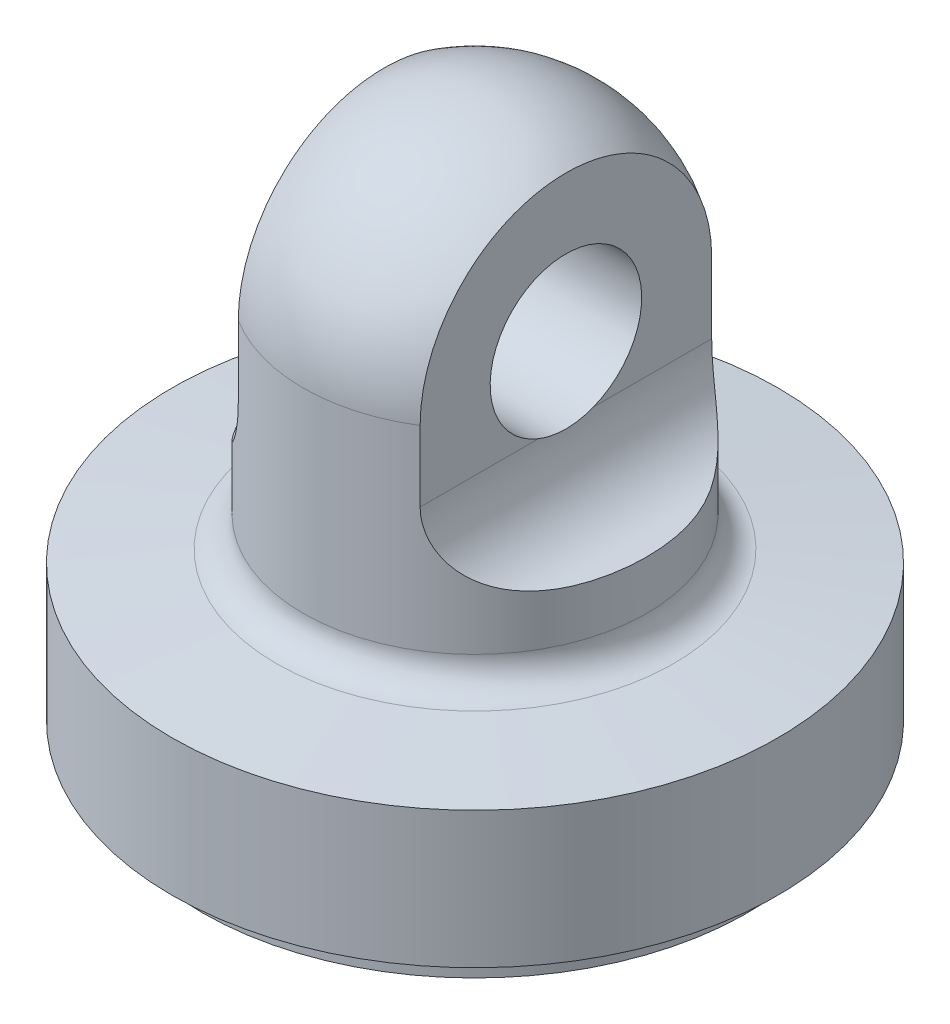
ISO-10303-21;
HEADER;
FILE_DESCRIPTION(('STEP AP214'),'2;1');
FILE_NAME('part.step','',(''),(''),'','','');
FILE_SCHEMA(('AUTOMOTIVE_DESIGN { 1 0 10303 214 1 1 1 1 }'));
ENDSEC;
DATA;
#1=APPLICATION_CONTEXT('core data for automotive mechanical design processes');
#2=APPLICATION_PROTOCOL_DEFINITION('international standard','automotive_design',2000,#1);
#3=PRODUCT_CONTEXT('',#1,'mechanical');
#4=PRODUCT('Part','Part','',(#3));
#5=PRODUCT_RELATED_PRODUCT_CATEGORY('part','',(#4));
#6=PRODUCT_DEFINITION_FORMATION('','',#4);
#7=PRODUCT_DEFINITION_CONTEXT('part definition',#1,'design');
#8=PRODUCT_DEFINITION('design','',#6,#7);
#9=PRODUCT_DEFINITION_SHAPE('','',#8);
#10=(LENGTH_UNIT() NAMED_UNIT(*) SI_UNIT(.MILLI.,.METRE.));
#11=(NAMED_UNIT(*) PLANE_ANGLE_UNIT() SI_UNIT($,.RADIAN.));
#12=(NAMED_UNIT(*) SI_UNIT($,.STERADIAN.) SOLID_ANGLE_UNIT());
#13=UNCERTAINTY_MEASURE_WITH_UNIT(LENGTH_MEASURE(1.E-05),#10,'distance_accuracy_value','');
#14=(GEOMETRIC_REPRESENTATION_CONTEXT(3) GLOBAL_UNCERTAINTY_ASSIGNED_CONTEXT((#13)) GLOBAL_UNIT_ASSIGNED_CONTEXT((#10,
#11,#12)) REPRESENTATION_CONTEXT('',''));
#15=CARTESIAN_POINT('',(0.,0.,0.));
#16=DIRECTION('',(0.,0.,1.));
#17=DIRECTION('',(1.,0.,0.));
#18=AXIS2_PLACEMENT_3D('',#15,#16,#17);
#19=CARTESIAN_POINT('',(0.,6.35,0.));
#20=DIRECTION('',(0.,1.,0.));
#21=DIRECTION('',(0.,0.,1.));
#22=AXIS2_PLACEMENT_3D('',#19,#20,#21);
#23=CYLINDRICAL_SURFACE('',#22,7.2009);
#24=DIRECTION('',(0.,1.,0.));
#25=VECTOR('',#24,1.);
#26=CARTESIAN_POINT('',(3.81,6.35,6.11038957923306));
#27=LINE('',#26,#25);
#28=CARTESIAN_POINT('',(3.81,15.6591,6.11038957923306));
#29=VERTEX_POINT('',#28);
#30=CARTESIAN_POINT('',(3.81,12.7,6.11038957923306));
#31=VERTEX_POINT('',#30);
#32=EDGE_CURVE('E118',#29,#31,#27,.F.);
#33=ORIENTED_EDGE('',*,*,#32,.F.);
#34=CARTESIAN_POINT('',(0.,15.6591,0.));
#35=DIRECTION('',(0.,1.,0.));
#36=DIRECTION('',(0.,0.,1.));
#37=AXIS2_PLACEMENT_3D('',#34,#35,#36);
#38=CIRCLE('',#37,7.2009);
#39=CARTESIAN_POINT('',(-3.81,15.6591,6.11038957923306));
#40=VERTEX_POINT('',#39);
#41=EDGE_CURVE('E120',#40,#29,#38,.T.);
#42=ORIENTED_EDGE('',*,*,#41,.F.);
#43=DIRECTION('',(0.,1.,0.));
#44=VECTOR('',#43,1.);
#45=CARTESIAN_POINT('',(-3.81,6.35,6.11038957923306));
#46=LINE('',#45,#44);
#47=CARTESIAN_POINT('',(-3.81,12.7,6.11038957923306));
#48=VERTEX_POINT('',#47);
#49=EDGE_CURVE('E105',#40,#48,#46,.F.);
#50=ORIENTED_EDGE('',*,*,#49,.T.);
#51=CARTESIAN_POINT('',(-3.81,12.7,6.11038957923306));
#52=CARTESIAN_POINT('',(-3.80998733358801,12.6231014532753,6.11038635616931));
#53=CARTESIAN_POINT('',(-3.81279349091128,12.5462070693066,6.10864746791412));
#54=CARTESIAN_POINT('',(-3.82394828994141,12.3929889222162,6.10167677945823));
#55=CARTESIAN_POINT('',(-3.83229632195482,12.316665097258,6.0964453634902));
#56=CARTESIAN_POINT('',(-3.85441689591902,12.1652895713145,6.0824824704275));
#57=CARTESIAN_POINT('',(-3.86817820699379,12.0902355699656,6.07375823918027));
#58=CARTESIAN_POINT('',(-3.90092084468937,11.9417997268901,6.05278055671562));
#59=CARTESIAN_POINT('',(-3.91990214251921,11.8684178759432,6.04052712496357));
#60=CARTESIAN_POINT('',(-3.98433550874055,11.6515195382029,5.99839168622441));
#61=CARTESIAN_POINT('',(-4.03729100701177,11.5111571195608,5.96312618319958));
#62=CARTESIAN_POINT('',(-4.16019062583858,11.2429910909109,5.87803668739616));
#63=CARTESIAN_POINT('',(-4.23013307938339,11.1151862502957,5.82821412307394));
#64=CARTESIAN_POINT('',(-4.38423949926996,10.8731046561016,5.71320820042626));
#65=CARTESIAN_POINT('',(-4.46859574191052,10.7590520196778,5.64781170713921));
#66=CARTESIAN_POINT('',(-4.64617052489352,10.5483686689604,5.50265371498206));
#67=CARTESIAN_POINT('',(-4.73939233147083,10.4517444138713,5.42288691207385));
#68=CARTESIAN_POINT('',(-4.93827246293446,10.2686739405031,5.24270095614019));
#69=CARTESIAN_POINT('',(-5.04431075178691,10.1838184712385,5.14109544815751));
#70=CARTESIAN_POINT('',(-5.25623482313289,10.033749254721,4.92422144314117));
#71=CARTESIAN_POINT('',(-5.36212051309106,9.96854455625662,4.80894668563177));
#72=CARTESIAN_POINT('',(-5.54709204545837,9.86775710215691,4.59329238505389));
#73=CARTESIAN_POINT('',(-5.62699314709021,9.82881586405256,4.49513485986877));
#74=CARTESIAN_POINT('',(-5.78292896143135,9.7601170052114,4.29267036741411));
#75=CARTESIAN_POINT('',(-5.85896188378571,9.73036360526523,4.18836060000114));
#76=CARTESIAN_POINT('',(-6.00626490029367,9.67860728816008,3.9742515266402));
#77=CARTESIAN_POINT('',(-6.07752366080192,9.65662231890872,3.86444016916531));
#78=CARTESIAN_POINT('',(-6.21439030598146,9.61912039823451,3.6402713030149));
#79=CARTESIAN_POINT('',(-6.27999651827241,9.60360535584605,3.52591246343391));
#80=CARTESIAN_POINT('',(-6.43051455061035,9.57249928552491,3.24591382668313));
#81=CARTESIAN_POINT('',(-6.51240458871308,9.55945163791039,3.07836028575431));
#82=CARTESIAN_POINT('',(-6.66306030764518,9.54045201566858,2.73704752743541));
#83=CARTESIAN_POINT('',(-6.7318207506157,9.5345028679364,2.56328586608596));
#84=CARTESIAN_POINT('',(-6.85566325153392,9.52702874357367,2.21082365670566));
#85=CARTESIAN_POINT('',(-6.91074169388705,9.52550493524484,2.03212181702222));
#86=CARTESIAN_POINT('',(-7.00682699844442,9.52471152842489,1.67100185543952));
#87=CARTESIAN_POINT('',(-7.04783548185924,9.52544167012544,1.48858416426687));
#88=CARTESIAN_POINT('',(-7.11629878695636,9.5275265352169,1.11701766687077));
#89=CARTESIAN_POINT('',(-7.14343113207907,9.52889481740594,0.927809456391798));
#90=CARTESIAN_POINT('',(-7.1825710149099,9.53109236924875,0.547827939624263));
#91=CARTESIAN_POINT('',(-7.19457819928696,9.53192162631041,0.357054596878234));
#92=CARTESIAN_POINT('',(-7.20339064331454,9.53251662510466,-0.0248852898666734));
#93=CARTESIAN_POINT('',(-7.20019276933215,9.53228214761108,-0.216051906800938));
#94=CARTESIAN_POINT('',(-7.17860912928656,9.53089049089978,-0.597519970973486));
#95=CARTESIAN_POINT('',(-7.16022327691978,9.5297333064389,-0.787821413289357));
#96=CARTESIAN_POINT('',(-7.1068252210731,9.52721812605474,-1.17770677055332));
#97=CARTESIAN_POINT('',(-7.07088302414944,9.52585225332619,-1.37716386124502));
#98=CARTESIAN_POINT('',(-6.9823069610051,9.524692697216,-1.77239078694926));
#99=CARTESIAN_POINT('',(-6.92966952679212,9.52489935012107,-1.96815982429291));
#100=CARTESIAN_POINT('',(-6.80813332907772,9.52934738581037,-2.354410700806));
#101=CARTESIAN_POINT('',(-6.7392449144971,9.53358620602486,-2.54489581894793));
#102=CARTESIAN_POINT('',(-6.58579115995243,9.54925291731517,-2.91910060382037));
#103=CARTESIAN_POINT('',(-6.50123405302712,9.56067704042131,-3.10282376310078));
#104=CARTESIAN_POINT('',(-6.35008509045248,9.58854941397494,-3.39798642622453));
#105=CARTESIAN_POINT('',(-6.28776917791238,9.60177521781386,-3.5119366518069));
#106=CARTESIAN_POINT('',(-6.15746128725953,9.63400724337432,-3.7356892986274));
#107=CARTESIAN_POINT('',(-6.0894708600034,9.65301188945527,-3.84549284132392));
#108=CARTESIAN_POINT('',(-5.94851003766728,9.69803760610971,-4.06012915731318));
#109=CARTESIAN_POINT('',(-5.8755476603564,9.72404757095896,-4.1649694922267));
#110=CARTESIAN_POINT('',(-5.72539617515466,9.78442691390213,-4.36907675644182));
#111=CARTESIAN_POINT('',(-5.64820820925843,9.81879404197259,-4.46834517704685));
#112=CARTESIAN_POINT('',(-5.50938937453864,9.88793573235742,-4.63773592511761));
#113=CARTESIAN_POINT('',(-5.44839237550929,9.92069502567928,-4.70920254310317));
#114=CARTESIAN_POINT('',(-5.32530426157729,9.99239830352572,-4.84795728682532));
#115=CARTESIAN_POINT('',(-5.26321342621698,10.0313407276948,-4.91524646082517));
#116=CARTESIAN_POINT('',(-5.13877989523449,10.1158668385997,-5.04519420162521));
#117=CARTESIAN_POINT('',(-5.0764373943672,10.1614460954836,-5.10785581543792));
#118=CARTESIAN_POINT('',(-4.9524501657472,10.2595848611706,-5.22816167402015));
#119=CARTESIAN_POINT('',(-4.89080533195859,10.3121432933429,-5.28580669040075));
#120=CARTESIAN_POINT('',(-4.7275823692143,10.4630171620506,-5.43340706528982));
#121=CARTESIAN_POINT('',(-4.62756950433674,10.5680177918102,-5.51845252697064));
#122=CARTESIAN_POINT('',(-4.43834189155268,10.7980740569018,-5.67177060536483));
#123=CARTESIAN_POINT('',(-4.34912347170927,10.923122838625,-5.74004893392349));
#124=CARTESIAN_POINT('',(-4.18680926440662,11.1915441087122,-5.85950692123186));
#125=CARTESIAN_POINT('',(-4.11378160364622,11.3349901599489,-5.91061477854303));
#126=CARTESIAN_POINT('',(-3.98925936427997,11.6357523958736,-5.99537406226361));
#127=CARTESIAN_POINT('',(-3.93775928648484,11.7930650259162,-6.02902994728255));
#128=CARTESIAN_POINT('',(-3.86949144410716,12.0756818023015,-6.07298774635886));
#129=CARTESIAN_POINT('',(-3.8472508943892,12.1991117048108,-6.08703081152104));
#130=CARTESIAN_POINT('',(-3.82493944522159,12.3860161188107,-6.1010547590217));
#131=CARTESIAN_POINT('',(-3.81934385297369,12.4486155173614,-6.10455596499964));
#132=CARTESIAN_POINT('',(-3.81187196473202,12.5741377564182,-6.10922266327482));
#133=CARTESIAN_POINT('',(-3.80999656902357,12.6370606715224,-6.11038759019468));
#134=CARTESIAN_POINT('',(-3.81,12.7,-6.11038957923306));
#135=B_SPLINE_CURVE_WITH_KNOTS('',3,(#51,#52,#53,#54,#55,#56,#57,#58,#59,#60,#61,#62,#63,#64,
#65,#66,#67,#68,#69,#70,#71,#72,#73,#74,#75,#76,#77,#78,#79,#80,#81,#82,#83,#84,#85,#86,#87,#88,
#89,#90,#91,#92,#93,#94,#95,#96,#97,#98,#99,#100,#101,#102,#103,#104,#105,#106,#107,#108,#109,
#110,#111,#112,#113,#114,#115,#116,#117,#118,#119,#120,#121,#122,#123,#124,#125,#126,#127,#128,
#129,#130,#131,#132,#133,#134),.UNSPECIFIED.,.F.,.F.,(4,2,2,2,2,2,2,2,2,2,2,2,2,2,2,2,2,2,2,2,2,
2,2,2,2,2,2,2,2,2,2,2,2,2,2,2,2,2,2,2,2,4),(0.,0.230617498194052,0.461209629036425,
0.691325854720207,0.921440811217572,1.38139068014647,1.8412954302308,2.3078978438225,
2.77467283313036,3.28160448955474,3.78876922248567,4.18550327362115,4.5824193097593,
4.98024646133317,5.37819091396325,5.93823359357548,6.49849922931978,7.05891276328739,
7.61926170191953,8.19210047656011,8.76495263274242,9.33792285398703,9.91089633107794,
10.5181926527958,11.1256188492937,11.7326592649817,12.3393816140509,12.7307565027546,
13.1220247759765,13.5126763752364,13.9032229144475,14.2014830428485,14.4996680225386,
14.7976548789104,15.0955958201265,15.5975879801723,16.09940889499,16.6033028789676,
17.1070680651935,17.4844147947459,17.6731159091838,17.861862683609),.UNSPECIFIED.);
#136=CARTESIAN_POINT('',(-3.81,12.7,-6.11038957923306));
#137=VERTEX_POINT('',#136);
#138=EDGE_CURVE('E147',#48,#137,#135,.T.);
#139=ORIENTED_EDGE('',*,*,#138,.T.);
#140=DIRECTION('',(0.,1.,0.));
#141=VECTOR('',#140,1.);
#142=CARTESIAN_POINT('',(-3.81,6.35,-6.11038957923306));
#143=LINE('',#142,#141);
#144=CARTESIAN_POINT('',(-3.81,15.6591,-6.11038957923306));
#145=VERTEX_POINT('',#144);
#146=EDGE_CURVE('E102',#137,#145,#143,.T.);
#147=ORIENTED_EDGE('',*,*,#146,.T.);
#148=CARTESIAN_POINT('',(3.81,15.6591,-6.11038957923306));
#149=VERTEX_POINT('',#148);
#150=EDGE_CURVE('E123',#149,#145,#38,.T.);
#151=ORIENTED_EDGE('',*,*,#150,.F.);
#152=DIRECTION('',(0.,1.,0.));
#153=VECTOR('',#152,1.);
#154=CARTESIAN_POINT('',(3.81,6.35,-6.11038957923306));
#155=LINE('',#154,#153);
#156=CARTESIAN_POINT('',(3.81,12.7,-6.11038957923306));
#157=VERTEX_POINT('',#156);
#158=EDGE_CURVE('E116',#157,#149,#155,.T.);
#159=ORIENTED_EDGE('',*,*,#158,.F.);
#160=CARTESIAN_POINT('',(3.81,12.7,6.11038957923306));
#161=CARTESIAN_POINT('',(3.80998733358801,12.6231014532753,6.11038635616931));
#162=CARTESIAN_POINT('',(3.81279349091128,12.5462070693066,6.10864746791412));
#163=CARTESIAN_POINT('',(3.82394828994141,12.3929889222162,6.10167677945823));
#164=CARTESIAN_POINT('',(3.83229632195482,12.316665097258,6.0964453634902));
#165=CARTESIAN_POINT('',(3.85441689591902,12.1652895713145,6.0824824704275));
#166=CARTESIAN_POINT('',(3.86817820699379,12.0902355699656,6.07375823918027));
#167=CARTESIAN_POINT('',(3.90092084468937,11.9417997268901,6.05278055671562));
#168=CARTESIAN_POINT('',(3.91990214251921,11.8684178759432,6.04052712496357));
#169=CARTESIAN_POINT('',(3.98433550874055,11.6515195382029,5.99839168622441));
#170=CARTESIAN_POINT('',(4.03729100701177,11.5111571195608,5.96312618319958));
#171=CARTESIAN_POINT('',(4.16019062583858,11.2429910909109,5.87803668739616));
#172=CARTESIAN_POINT('',(4.23013307938339,11.1151862502957,5.82821412307394));
#173=CARTESIAN_POINT('',(4.38423949926996,10.8731046561016,5.71320820042626));
#174=CARTESIAN_POINT('',(4.46859574191052,10.7590520196778,5.64781170713921));
#175=CARTESIAN_POINT('',(4.64617052489352,10.5483686689604,5.50265371498206));
#176=CARTESIAN_POINT('',(4.73939233147083,10.4517444138713,5.42288691207385));
#177=CARTESIAN_POINT('',(4.93827246293446,10.2686739405031,5.24270095614019));
#178=CARTESIAN_POINT('',(5.04431075178691,10.1838184712385,5.14109544815751));
#179=CARTESIAN_POINT('',(5.25623482313289,10.033749254721,4.92422144314117));
#180=CARTESIAN_POINT('',(5.36212051309106,9.96854455625662,4.80894668563177));
#181=CARTESIAN_POINT('',(5.54709204545837,9.86775710215691,4.59329238505389));
#182=CARTESIAN_POINT('',(5.62699314709021,9.82881586405256,4.49513485986877));
#183=CARTESIAN_POINT('',(5.78292896143135,9.7601170052114,4.29267036741411));
#184=CARTESIAN_POINT('',(5.85896188378571,9.73036360526523,4.18836060000114));
#185=CARTESIAN_POINT('',(6.00626490029367,9.67860728816008,3.9742515266402));
#186=CARTESIAN_POINT('',(6.07752366080192,9.65662231890872,3.86444016916531));
#187=CARTESIAN_POINT('',(6.21439030598146,9.61912039823451,3.6402713030149));
#188=CARTESIAN_POINT('',(6.27999651827241,9.60360535584605,3.52591246343391));
#189=CARTESIAN_POINT('',(6.43051455061035,9.57249928552491,3.24591382668313));
#190=CARTESIAN_POINT('',(6.51240458871308,9.55945163791039,3.07836028575431));
#191=CARTESIAN_POINT('',(6.66306030764518,9.54045201566858,2.73704752743541));
#192=CARTESIAN_POINT('',(6.7318207506157,9.5345028679364,2.56328586608596));
#193=CARTESIAN_POINT('',(6.85566325153392,9.52702874357367,2.21082365670566));
#194=CARTESIAN_POINT('',(6.91074169388705,9.52550493524484,2.03212181702222));
#195=CARTESIAN_POINT('',(7.00682699844442,9.52471152842489,1.67100185543952));
#196=CARTESIAN_POINT('',(7.04783548185924,9.52544167012544,1.48858416426687));
#197=CARTESIAN_POINT('',(7.11629878695636,9.5275265352169,1.11701766687077));
#198=CARTESIAN_POINT('',(7.14343113207907,9.52889481740594,0.927809456391798));
#199=CARTESIAN_POINT('',(7.1825710149099,9.53109236924875,0.547827939624263));
#200=CARTESIAN_POINT('',(7.19457819928696,9.53192162631041,0.357054596878234));
#201=CARTESIAN_POINT('',(7.20339064331454,9.53251662510466,-0.0248852898666734));
#202=CARTESIAN_POINT('',(7.20019276933215,9.53228214761108,-0.216051906800938));
#203=CARTESIAN_POINT('',(7.17860912928656,9.53089049089978,-0.597519970973486));
#204=CARTESIAN_POINT('',(7.16022327691978,9.5297333064389,-0.787821413289357));
#205=CARTESIAN_POINT('',(7.1068252210731,9.52721812605474,-1.17770677055332));
#206=CARTESIAN_POINT('',(7.07088302414944,9.52585225332619,-1.37716386124502));
#207=CARTESIAN_POINT('',(6.9823069610051,9.524692697216,-1.77239078694926));
#208=CARTESIAN_POINT('',(6.92966952679212,9.52489935012107,-1.96815982429291));
#209=CARTESIAN_POINT('',(6.80813332907772,9.52934738581037,-2.354410700806));
#210=CARTESIAN_POINT('',(6.7392449144971,9.53358620602486,-2.54489581894793));
#211=CARTESIAN_POINT('',(6.58579115995243,9.54925291731517,-2.91910060382037));
#212=CARTESIAN_POINT('',(6.50123405302712,9.56067704042131,-3.10282376310078));
#213=CARTESIAN_POINT('',(6.35008509045248,9.58854941397494,-3.39798642622453));
#214=CARTESIAN_POINT('',(6.28776917791238,9.60177521781386,-3.5119366518069));
#215=CARTESIAN_POINT('',(6.15746128725953,9.63400724337432,-3.7356892986274));
#216=CARTESIAN_POINT('',(6.0894708600034,9.65301188945527,-3.84549284132392));
#217=CARTESIAN_POINT('',(5.94851003766728,9.69803760610971,-4.06012915731318));
#218=CARTESIAN_POINT('',(5.8755476603564,9.72404757095896,-4.1649694922267));
#219=CARTESIAN_POINT('',(5.72539617515466,9.78442691390213,-4.36907675644182));
#220=CARTESIAN_POINT('',(5.64820820925843,9.81879404197259,-4.46834517704685));
#221=CARTESIAN_POINT('',(5.50938937453864,9.88793573235742,-4.63773592511761));
#222=CARTESIAN_POINT('',(5.44839237550929,9.92069502567928,-4.70920254310317));
#223=CARTESIAN_POINT('',(5.32530426157729,9.99239830352572,-4.84795728682532));
#224=CARTESIAN_POINT('',(5.26321342621698,10.0313407276948,-4.91524646082517));
#225=CARTESIAN_POINT('',(5.13877989523449,10.1158668385997,-5.04519420162521));
#226=CARTESIAN_POINT('',(5.0764373943672,10.1614460954836,-5.10785581543792));
#227=CARTESIAN_POINT('',(4.9524501657472,10.2595848611706,-5.22816167402015));
#228=CARTESIAN_POINT('',(4.89080533195859,10.3121432933429,-5.28580669040075));
#229=CARTESIAN_POINT('',(4.7275823692143,10.4630171620506,-5.43340706528982));
#230=CARTESIAN_POINT('',(4.62756950433674,10.5680177918102,-5.51845252697064));
#231=CARTESIAN_POINT('',(4.43834189155268,10.7980740569018,-5.67177060536483));
#232=CARTESIAN_POINT('',(4.34912347170927,10.923122838625,-5.74004893392349));
#233=CARTESIAN_POINT('',(4.18680926440662,11.1915441087122,-5.85950692123186));
#234=CARTESIAN_POINT('',(4.11378160364622,11.3349901599489,-5.91061477854303));
#235=CARTESIAN_POINT('',(3.98925936427997,11.6357523958736,-5.99537406226361));
#236=CARTESIAN_POINT('',(3.93775928648484,11.7930650259162,-6.02902994728255));
#237=CARTESIAN_POINT('',(3.86949144410716,12.0756818023015,-6.07298774635886));
#238=CARTESIAN_POINT('',(3.8472508943892,12.1991117048108,-6.08703081152104));
#239=CARTESIAN_POINT('',(3.82493944522159,12.3860161188107,-6.1010547590217));
#240=CARTESIAN_POINT('',(3.81934385297369,12.4486155173614,-6.10455596499964));
#241=CARTESIAN_POINT('',(3.81187196473202,12.5741377564182,-6.10922266327482));
#242=CARTESIAN_POINT('',(3.80999656902357,12.6370606715224,-6.11038759019468));
#243=CARTESIAN_POINT('',(3.81,12.7,-6.11038957923306));
#244=B_SPLINE_CURVE_WITH_KNOTS('',3,(#160,#161,#162,#163,#164,#165,#166,#167,#168,#169,#170,
#171,#172,#173,#174,#175,#176,#177,#178,#179,#180,#181,#182,#183,#184,#185,#186,#187,#188,#189,
#190,#191,#192,#193,#194,#195,#196,#197,#198,#199,#200,#201,#202,#203,#204,#205,#206,#207,#208,
#209,#210,#211,#212,#213,#214,#215,#216,#217,#218,#219,#220,#221,#222,#223,#224,#225,#226,#227,
#228,#229,#230,#231,#232,#233,#234,#235,#236,#237,#238,#239,#240,#241,#242,#243),.UNSPECIFIED.,
.F.,.F.,(4,2,2,2,2,2,2,2,2,2,2,2,2,2,2,2,2,2,2,2,2,2,2,2,2,2,2,2,2,2,2,2,2,2,2,2,2,2,2,2,2,4),
(0.,0.230617498194052,0.461209629036425,0.691325854720207,0.921440811217572,1.38139068014647,
1.8412954302308,2.3078978438225,2.77467283313036,3.28160448955474,3.78876922248567,
4.18550327362115,4.5824193097593,4.98024646133317,5.37819091396325,5.93823359357548,
6.49849922931978,7.05891276328739,7.61926170191953,8.19210047656011,8.76495263274242,
9.33792285398703,9.91089633107794,10.5181926527958,11.1256188492937,11.7326592649817,
12.3393816140509,12.7307565027546,13.1220247759765,13.5126763752364,13.9032229144475,
14.2014830428485,14.4996680225386,14.7976548789104,15.0955958201265,15.5975879801723,
16.09940889499,16.6033028789676,17.1070680651935,17.4844147947459,17.6731159091838,
17.861862683609),.UNSPECIFIED.);
#245=EDGE_CURVE('E46',#31,#157,#244,.T.);
#246=ORIENTED_EDGE('',*,*,#245,.F.);
#247=EDGE_LOOP('',(#33,#42,#50,#139,#147,#151,#159,#246));
#248=FACE_BOUND('',#247,.T.);
#249=CARTESIAN_POINT('',(0.,7.48178785429264,0.));
#250=DIRECTION('',(0.,1.,0.));
#251=DIRECTION('',(0.,0.,1.));
#252=AXIS2_PLACEMENT_3D('',#249,#250,#251);
#253=CIRCLE('',#252,7.2009);
#254=CARTESIAN_POINT('',(0.,7.48178785429264,7.2009));
#255=VERTEX_POINT('',#254);
#256=EDGE_CURVE('E124',#255,#255,#253,.T.);
#257=ORIENTED_EDGE('',*,*,#256,.T.);
#258=EDGE_LOOP('',(#257));
#259=FACE_BOUND('',#258,.T.);
#260=ADVANCED_FACE('F33',(#248,#259),#23,.T.);
#261=CARTESIAN_POINT('',(0.,15.6591,0.));
#262=DIRECTION('',(0.,1.,0.));
#263=DIRECTION('',(1.,0.,0.));
#264=AXIS2_PLACEMENT_3D('',#261,#262,#263);
#265=SPHERICAL_SURFACE('',#264,7.2009);
#266=CARTESIAN_POINT('',(3.81,15.6591,0.));
#267=DIRECTION('',(-1.,0.,0.));
#268=DIRECTION('',(0.,-1.,0.));
#269=AXIS2_PLACEMENT_3D('',#266,#267,#268);
#270=CIRCLE('',#269,6.11038957923306);
#271=EDGE_CURVE('E145',#149,#29,#270,.F.);
#272=ORIENTED_EDGE('',*,*,#271,.F.);
#273=ORIENTED_EDGE('',*,*,#150,.T.);
#274=CARTESIAN_POINT('',(-3.81,15.6591,0.));
#275=DIRECTION('',(-1.,0.,0.));
#276=DIRECTION('',(0.,-1.,0.));
#277=AXIS2_PLACEMENT_3D('',#274,#275,#276);
#278=CIRCLE('',#277,6.11038957923306);
#279=EDGE_CURVE('E142',#145,#40,#278,.F.);
#280=ORIENTED_EDGE('',*,*,#279,.T.);
#281=ORIENTED_EDGE('',*,*,#41,.T.);
#282=EDGE_LOOP('',(#272,#273,#280,#281));
#283=FACE_BOUND('',#282,.T.);
#284=ADVANCED_FACE('F181',(#283),#265,.T.);
#285=CARTESIAN_POINT('',(-11.43,-1.27,0.));
#286=DIRECTION('',(0.,-1.,0.));
#287=DIRECTION('',(0.,0.,-1.));
#288=AXIS2_PLACEMENT_3D('',#285,#286,#287);
#289=PLANE('',#288);
#290=CARTESIAN_POINT('',(0.,-1.27,0.));
#291=DIRECTION('',(0.,1.,0.));
#292=DIRECTION('',(0.,0.,1.));
#293=AXIS2_PLACEMENT_3D('',#290,#291,#292);
#294=CIRCLE('',#293,11.43);
#295=CARTESIAN_POINT('',(0.,-1.27,11.43));
#296=VERTEX_POINT('',#295);
#297=EDGE_CURVE('E139',#296,#296,#294,.T.);
#298=ORIENTED_EDGE('',*,*,#297,.F.);
#299=EDGE_LOOP('',(#298));
#300=FACE_BOUND('',#299,.T.);
#301=ADVANCED_FACE('F35',(#300),#289,.T.);
#302=CARTESIAN_POINT('',(0.,6.35,0.));
#303=DIRECTION('',(0.,1.,0.));
#304=DIRECTION('',(0.,0.,1.));
#305=AXIS2_PLACEMENT_3D('',#302,#303,#304);
#306=CYLINDRICAL_SURFACE('',#305,11.43);
#307=ORIENTED_EDGE('',*,*,#297,.T.);
#308=EDGE_LOOP('',(#307));
#309=FACE_BOUND('',#308,.T.);
#310=CARTESIAN_POINT('',(0.,0.,0.));
#311=DIRECTION('',(0.,1.,0.));
#312=DIRECTION('',(0.,0.,1.));
#313=AXIS2_PLACEMENT_3D('',#310,#311,#312);
#314=CIRCLE('',#313,11.43);
#315=CARTESIAN_POINT('',(0.,0.,11.43));
#316=VERTEX_POINT('',#315);
#317=EDGE_CURVE('E136',#316,#316,#314,.T.);
#318=ORIENTED_EDGE('',*,*,#317,.F.);
#319=EDGE_LOOP('',(#318));
#320=FACE_BOUND('',#319,.T.);
#321=ADVANCED_FACE('F210',(#309,#320),#306,.T.);
#322=CARTESIAN_POINT('',(-12.7,0.,0.));
#323=DIRECTION('',(0.,-1.,0.));
#324=DIRECTION('',(0.,0.,-1.));
#325=AXIS2_PLACEMENT_3D('',#322,#323,#324);
#326=PLANE('',#325);
#327=ORIENTED_EDGE('',*,*,#317,.T.);
#328=EDGE_LOOP('',(#327));
#329=FACE_BOUND('',#328,.T.);
#330=CARTESIAN_POINT('',(0.,0.,0.));
#331=DIRECTION('',(0.,1.,0.));
#332=DIRECTION('',(0.,0.,1.));
#333=AXIS2_PLACEMENT_3D('',#330,#331,#332);
#334=CIRCLE('',#333,12.7);
#335=CARTESIAN_POINT('',(0.,0.,12.7));
#336=VERTEX_POINT('',#335);
#337=EDGE_CURVE('E133',#336,#336,#334,.T.);
#338=ORIENTED_EDGE('',*,*,#337,.F.);
#339=EDGE_LOOP('',(#338));
#340=FACE_BOUND('',#339,.T.);
#341=ADVANCED_FACE('F207',(#329,#340),#326,.T.);
#342=CARTESIAN_POINT('',(0.,6.35,0.));
#343=DIRECTION('',(0.,1.,0.));
#344=DIRECTION('',(0.,0.,1.));
#345=AXIS2_PLACEMENT_3D('',#342,#343,#344);
#346=CYLINDRICAL_SURFACE('',#345,12.7);
#347=ORIENTED_EDGE('',*,*,#337,.T.);
#348=EDGE_LOOP('',(#347));
#349=FACE_BOUND('',#348,.T.);
#350=CARTESIAN_POINT('',(0.,5.715,0.));
#351=DIRECTION('',(0.,1.,0.));
#352=DIRECTION('',(0.,0.,1.));
#353=AXIS2_PLACEMENT_3D('',#350,#351,#352);
#354=CIRCLE('',#353,12.7);
#355=CARTESIAN_POINT('',(0.,5.715,12.7));
#356=VERTEX_POINT('',#355);
#357=EDGE_CURVE('E130',#356,#356,#354,.T.);
#358=ORIENTED_EDGE('',*,*,#357,.F.);
#359=EDGE_LOOP('',(#358));
#360=FACE_BOUND('',#359,.T.);
#361=ADVANCED_FACE('F201',(#349,#360),#346,.T.);
#362=CARTESIAN_POINT('',(0.,6.22017127115639,0.));
#363=DIRECTION('',(0.,-1.,0.));
#364=DIRECTION('',(0.,0.,-1.));
#365=AXIS2_PLACEMENT_3D('',#362,#363,#364);
#366=CONICAL_SURFACE('',#365,8.32521679178565,1.45583206359421);
#367=ORIENTED_EDGE('',*,*,#357,.T.);
#368=EDGE_LOOP('',(#367));
#369=FACE_BOUND('',#368,.T.);
#370=CARTESIAN_POINT('',(0.,6.22017127115639,0.));
#371=DIRECTION('',(0.,1.,0.));
#372=DIRECTION('',(0.,0.,1.));
#373=AXIS2_PLACEMENT_3D('',#370,#371,#372);
#374=CIRCLE('',#373,8.32521679178565);
#375=CARTESIAN_POINT('',(0.,6.22017127115639,8.32521679178565));
#376=VERTEX_POINT('',#375);
#377=EDGE_CURVE('E127',#376,#376,#374,.T.);
#378=ORIENTED_EDGE('',*,*,#377,.F.);
#379=EDGE_LOOP('',(#378));
#380=FACE_BOUND('',#379,.T.);
#381=ADVANCED_FACE('F194',(#369,#380),#366,.T.);
#382=CARTESIAN_POINT('',(0.,7.48178785429264,0.));
#383=DIRECTION('',(0.,1.,0.));
#384=DIRECTION('',(0.,0.,1.));
#385=AXIS2_PLACEMENT_3D('',#382,#383,#384);
#386=TOROIDAL_SURFACE('',#385,8.4709,1.27);
#387=ORIENTED_EDGE('',*,*,#377,.T.);
#388=EDGE_LOOP('',(#387));
#389=FACE_BOUND('',#388,.T.);
#390=ORIENTED_EDGE('',*,*,#256,.F.);
#391=EDGE_LOOP('',(#390));
#392=FACE_BOUND('',#391,.T.);
#393=ADVANCED_FACE('F192',(#389,#392),#386,.F.);
#394=CARTESIAN_POINT('',(-3.81,22.86,-12.7));
#395=DIRECTION('',(-1.,0.,0.));
#396=DIRECTION('',(0.,-1.,0.));
#397=AXIS2_PLACEMENT_3D('',#394,#395,#396);
#398=PLANE('',#397);
#399=CARTESIAN_POINT('',(-3.81,15.6591,0.));
#400=DIRECTION('',(-1.,0.,0.));
#401=DIRECTION('',(0.,-1.,0.));
#402=AXIS2_PLACEMENT_3D('',#399,#400,#401);
#403=CIRCLE('',#402,3.175);
#404=CARTESIAN_POINT('',(-3.81,12.7,1.15080501823724));
#405=VERTEX_POINT('',#404);
#406=CARTESIAN_POINT('',(-3.81,12.7,-1.15080501823723));
#407=VERTEX_POINT('',#406);
#408=EDGE_CURVE('E52',#405,#407,#403,.T.);
#409=ORIENTED_EDGE('',*,*,#408,.F.);
#410=DIRECTION('',(0.,0.,1.));
#411=VECTOR('',#410,1.);
#412=CARTESIAN_POINT('',(-3.81,12.7,-12.7));
#413=LINE('',#412,#411);
#414=EDGE_CURVE('E112',#405,#48,#413,.T.);
#415=ORIENTED_EDGE('',*,*,#414,.T.);
#416=ORIENTED_EDGE('',*,*,#49,.F.);
#417=ORIENTED_EDGE('',*,*,#279,.F.);
#418=ORIENTED_EDGE('',*,*,#146,.F.);
#419=EDGE_CURVE('E107',#137,#407,#413,.T.);
#420=ORIENTED_EDGE('',*,*,#419,.T.);
#421=EDGE_LOOP('',(#409,#415,#416,#417,#418,#420));
#422=FACE_BOUND('',#421,.T.);
#423=ADVANCED_FACE('F165',(#422),#398,.T.);
#424=CARTESIAN_POINT('',(-6.985,12.7,-12.7));
#425=DIRECTION('',(0.,0.,1.));
#426=DIRECTION('',(1.,0.,0.));
#427=AXIS2_PLACEMENT_3D('',#424,#425,#426);
#428=CYLINDRICAL_SURFACE('',#427,3.175);
#429=CARTESIAN_POINT('',(-3.81,12.7,-1.15080501823724));
#430=CARTESIAN_POINT('',(-3.81002339611876,12.6676709480418,-1.06770211852475));
#431=CARTESIAN_POINT('',(-3.81049485803839,12.6388616185873,-0.983235170105028));
#432=CARTESIAN_POINT('',(-3.81185384312562,12.5884449847997,-0.812180556369154));
#433=CARTESIAN_POINT('',(-3.81274136933871,12.566837733186,-0.725592875534186));
#434=CARTESIAN_POINT('',(-3.81445343324419,12.5309666282981,-0.550799745218378));
#435=CARTESIAN_POINT('',(-3.8152778934354,12.5167116905417,-0.462592465320763));
#436=CARTESIAN_POINT('',(-3.81656283112022,12.4956841259356,-0.285293621779998));
#437=CARTESIAN_POINT('',(-3.81702333333011,12.4889109909867,-0.196202118600307));
#438=CARTESIAN_POINT('',(-3.81743029549092,12.4828925848461,-0.0176960642956959));
#439=CARTESIAN_POINT('',(-3.8173763632169,12.4836530575882,0.0717186813549191));
#440=CARTESIAN_POINT('',(-3.81677073187476,12.4927103409081,0.250164092086279));
#441=CARTESIAN_POINT('',(-3.81621903658917,12.5010070942174,0.339194760080479));
#442=CARTESIAN_POINT('',(-3.81480115611041,12.5250477141103,0.516029726119425));
#443=CARTESIAN_POINT('',(-3.81393569623573,12.5407744303249,0.603836371454246));
#444=CARTESIAN_POINT('',(-3.8122261535973,12.5795516066959,0.777778026827594));
#445=CARTESIAN_POINT('',(-3.81138205858091,12.6025977615019,0.8639139880515));
#446=CARTESIAN_POINT('',(-3.81055159258283,12.6398799435382,0.982959910560128));
#447=CARTESIAN_POINT('',(-3.81035435778872,12.6511180474531,1.01683007870654));
#448=CARTESIAN_POINT('',(-3.81007875138538,12.6747178806433,1.08413941950069));
#449=CARTESIAN_POINT('',(-3.81000026208465,12.6870784844813,1.11757898628355));
#450=CARTESIAN_POINT('',(-3.81,12.7,1.15080501823724));
#451=B_SPLINE_CURVE_WITH_KNOTS('',3,(#429,#430,#431,#432,#433,#434,#435,#436,#437,#438,#439,
#440,#441,#442,#443,#444,#445,#446,#447,#448,#449,#450),.UNSPECIFIED.,.F.,.F.,(4,2,2,2,2,2,2,2,
2,2,4),(0.,0.267423123323583,0.534848204145891,0.802596810397232,1.07032723235919,
1.33826179875792,1.60619432912913,1.87351139792089,2.14067151905805,2.24771456325778,
2.35465144488257),.UNSPECIFIED.);
#452=EDGE_CURVE('E98',#407,#405,#451,.T.);
#453=ORIENTED_EDGE('',*,*,#452,.F.);
#454=ORIENTED_EDGE('',*,*,#419,.F.);
#455=ORIENTED_EDGE('',*,*,#138,.F.);
#456=ORIENTED_EDGE('',*,*,#414,.F.);
#457=EDGE_LOOP('',(#453,#454,#455,#456));
#458=FACE_BOUND('',#457,.T.);
#459=ADVANCED_FACE('F160',(#458),#428,.F.);
#460=CARTESIAN_POINT('',(3.81,22.86,-12.7));
#461=DIRECTION('',(-1.,0.,0.));
#462=DIRECTION('',(0.,-1.,0.));
#463=AXIS2_PLACEMENT_3D('',#460,#461,#462);
#464=PLANE('',#463);
#465=DIRECTION('',(0.,0.,1.));
#466=VECTOR('',#465,1.);
#467=CARTESIAN_POINT('',(3.81,12.7,-12.7));
#468=LINE('',#467,#466);
#469=CARTESIAN_POINT('',(3.81,12.7,1.15080501823722));
#470=VERTEX_POINT('',#469);
#471=EDGE_CURVE('E97',#470,#31,#468,.T.);
#472=ORIENTED_EDGE('',*,*,#471,.F.);
#473=CARTESIAN_POINT('',(3.81,15.6591,0.));
#474=DIRECTION('',(-1.,0.,0.));
#475=DIRECTION('',(0.,-1.,0.));
#476=AXIS2_PLACEMENT_3D('',#473,#474,#475);
#477=CIRCLE('',#476,3.175);
#478=CARTESIAN_POINT('',(3.81,12.7,-1.15080501823723));
#479=VERTEX_POINT('',#478);
#480=EDGE_CURVE('E59',#470,#479,#477,.T.);
#481=ORIENTED_EDGE('',*,*,#480,.T.);
#482=EDGE_CURVE('E94',#157,#479,#468,.T.);
#483=ORIENTED_EDGE('',*,*,#482,.F.);
#484=ORIENTED_EDGE('',*,*,#158,.T.);
#485=ORIENTED_EDGE('',*,*,#271,.T.);
#486=ORIENTED_EDGE('',*,*,#32,.T.);
#487=EDGE_LOOP('',(#472,#481,#483,#484,#485,#486));
#488=FACE_BOUND('',#487,.T.);
#489=ADVANCED_FACE('F93',(#488),#464,.F.);
#490=CARTESIAN_POINT('',(6.985,12.7,-12.7));
#491=DIRECTION('',(0.,0.,1.));
#492=DIRECTION('',(1.,0.,0.));
#493=AXIS2_PLACEMENT_3D('',#490,#491,#492);
#494=CYLINDRICAL_SURFACE('',#493,3.175);
#495=ORIENTED_EDGE('',*,*,#482,.T.);
#496=CARTESIAN_POINT('',(3.81,12.7,-1.15080501823723));
#497=CARTESIAN_POINT('',(3.81002339611875,12.6676709480417,-1.06770211852474));
#498=CARTESIAN_POINT('',(3.81049485803839,12.6388616185873,-0.983235170105016));
#499=CARTESIAN_POINT('',(3.81185384312562,12.5884449847997,-0.812180556369142));
#500=CARTESIAN_POINT('',(3.81274136933871,12.566837733186,-0.725592875534174));
#501=CARTESIAN_POINT('',(3.81445343324419,12.5309666282981,-0.550799745218365));
#502=CARTESIAN_POINT('',(3.8152778934354,12.5167116905417,-0.462592465320751));
#503=CARTESIAN_POINT('',(3.81656283112022,12.4956841259356,-0.285293621779985));
#504=CARTESIAN_POINT('',(3.81702333333011,12.4889109909867,-0.196202118600295));
#505=CARTESIAN_POINT('',(3.81743029549092,12.4828925848461,-0.0176960642956836));
#506=CARTESIAN_POINT('',(3.8173763632169,12.4836530575882,0.0717186813549312));
#507=CARTESIAN_POINT('',(3.81677073187476,12.4927103409081,0.250164092086291));
#508=CARTESIAN_POINT('',(3.81621903658917,12.5010070942174,0.339194760080491));
#509=CARTESIAN_POINT('',(3.81480115611041,12.5250477141103,0.516029726119437));
#510=CARTESIAN_POINT('',(3.81393569623573,12.5407744303249,0.603836371454258));
#511=CARTESIAN_POINT('',(3.8122261535973,12.5795516066959,0.777778026827606));
#512=CARTESIAN_POINT('',(3.81138205858091,12.6025977615019,0.863913988051511));
#513=CARTESIAN_POINT('',(3.81055159258283,12.6398799435382,0.982959910560135));
#514=CARTESIAN_POINT('',(3.81035435778872,12.6511180474531,1.01683007870654));
#515=CARTESIAN_POINT('',(3.81007875138538,12.6747178806432,1.08413941950068));
#516=CARTESIAN_POINT('',(3.81000026208465,12.6870784844813,1.11757898628354));
#517=CARTESIAN_POINT('',(3.81,12.7,1.15080501823723));
#518=B_SPLINE_CURVE_WITH_KNOTS('',3,(#496,#497,#498,#499,#500,#501,#502,#503,#504,#505,#506,
#507,#508,#509,#510,#511,#512,#513,#514,#515,#516,#517),.UNSPECIFIED.,.F.,.F.,(4,2,2,2,2,2,2,2,
2,2,4),(0.,0.267423123323582,0.53484820414589,0.802596810397231,1.07032723235919,
1.33826179875792,1.60619432912913,1.87351139792089,2.14067151905805,2.24771456325776,
2.35465144488254),.UNSPECIFIED.);
#519=EDGE_CURVE('E11',#479,#470,#518,.T.);
#520=ORIENTED_EDGE('',*,*,#519,.T.);
#521=ORIENTED_EDGE('',*,*,#471,.T.);
#522=ORIENTED_EDGE('',*,*,#245,.T.);
#523=EDGE_LOOP('',(#495,#520,#521,#522));
#524=FACE_BOUND('',#523,.T.);
#525=ADVANCED_FACE('F100',(#524),#494,.F.);
#526=CARTESIAN_POINT('',(12.7,15.6591,0.));
#527=DIRECTION('',(-1.,0.,0.));
#528=DIRECTION('',(0.,-1.,0.));
#529=AXIS2_PLACEMENT_3D('',#526,#527,#528);
#530=CYLINDRICAL_SURFACE('',#529,3.175);
#531=ORIENTED_EDGE('',*,*,#408,.T.);
#532=ORIENTED_EDGE('',*,*,#452,.T.);
#533=EDGE_LOOP('',(#531,#532));
#534=FACE_BOUND('',#533,.T.);
#535=ORIENTED_EDGE('',*,*,#519,.F.);
#536=ORIENTED_EDGE('',*,*,#480,.F.);
#537=EDGE_LOOP('',(#535,#536));
#538=FACE_BOUND('',#537,.T.);
#539=ADVANCED_FACE('F87',(#534,#538),#530,.F.);
#540=CLOSED_SHELL('',(#260,#284,#301,#321,#341,#361,#381,#393,#423,#459,#489,#525,#539));
#541=MANIFOLD_SOLID_BREP('B2',#540);
#542=ADVANCED_BREP_SHAPE_REPRESENTATION('',(#18,#541),#14);
#543=SHAPE_DEFINITION_REPRESENTATION(#9,#542);
ENDSEC;
END-ISO-10303-21;
